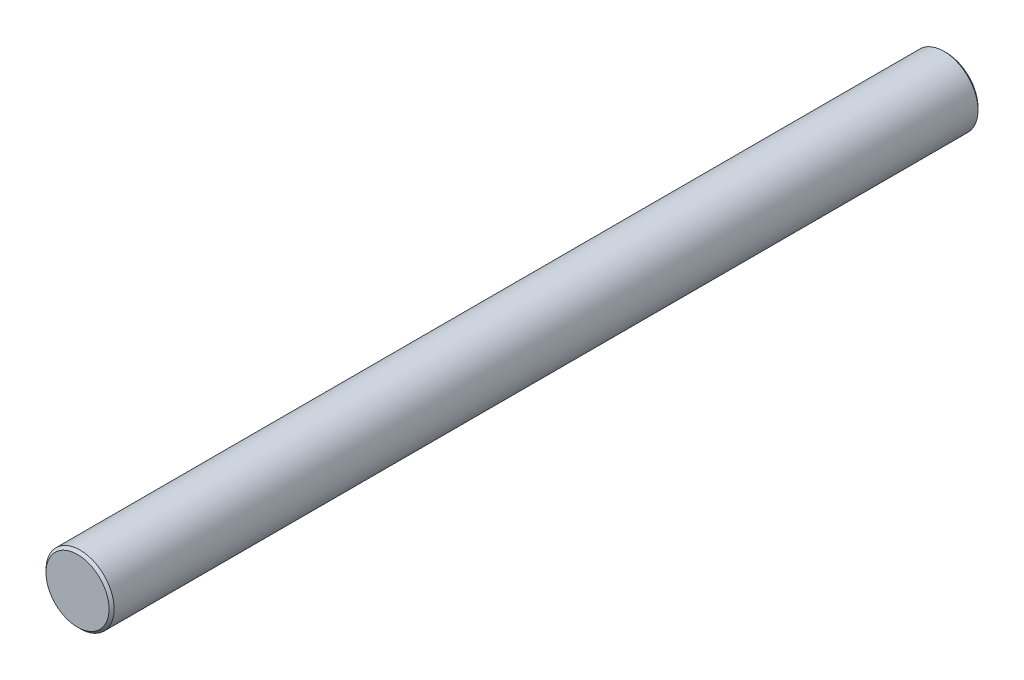
ISO-10303-21;
HEADER;
FILE_DESCRIPTION(('STEP AP214'),'2;1');
FILE_NAME('part.step','',(''),(''),'','','');
FILE_SCHEMA(('AUTOMOTIVE_DESIGN { 1 0 10303 214 1 1 1 1 }'));
ENDSEC;
DATA;
#1=APPLICATION_CONTEXT('core data for automotive mechanical design processes');
#2=APPLICATION_PROTOCOL_DEFINITION('international standard','automotive_design',2000,#1);
#3=PRODUCT_CONTEXT('',#1,'mechanical');
#4=PRODUCT('Part','Part','',(#3));
#5=PRODUCT_RELATED_PRODUCT_CATEGORY('part','',(#4));
#6=PRODUCT_DEFINITION_FORMATION('','',#4);
#7=PRODUCT_DEFINITION_CONTEXT('part definition',#1,'design');
#8=PRODUCT_DEFINITION('design','',#6,#7);
#9=PRODUCT_DEFINITION_SHAPE('','',#8);
#10=(LENGTH_UNIT() NAMED_UNIT(*) SI_UNIT(.MILLI.,.METRE.));
#11=(NAMED_UNIT(*) PLANE_ANGLE_UNIT() SI_UNIT($,.RADIAN.));
#12=(NAMED_UNIT(*) SI_UNIT($,.STERADIAN.) SOLID_ANGLE_UNIT());
#13=UNCERTAINTY_MEASURE_WITH_UNIT(LENGTH_MEASURE(1.E-05),#10,'distance_accuracy_value','');
#14=(GEOMETRIC_REPRESENTATION_CONTEXT(3) GLOBAL_UNCERTAINTY_ASSIGNED_CONTEXT((#13)) GLOBAL_UNIT_ASSIGNED_CONTEXT((#10,
#11,#12)) REPRESENTATION_CONTEXT('',''));
#15=CARTESIAN_POINT('',(0.,0.,0.));
#16=DIRECTION('',(0.,0.,1.));
#17=DIRECTION('',(1.,0.,0.));
#18=AXIS2_PLACEMENT_3D('',#15,#16,#17);
#19=CARTESIAN_POINT('',(0.,9.25,0.));
#20=DIRECTION('',(0.,0.,-1.));
#21=DIRECTION('',(0.,1.,0.));
#22=AXIS2_PLACEMENT_3D('',#19,#20,#21);
#23=PLANE('',#22);
#24=CARTESIAN_POINT('',(0.,0.,0.));
#25=DIRECTION('',(0.,0.,-1.));
#26=DIRECTION('',(0.,1.,0.));
#27=AXIS2_PLACEMENT_3D('',#24,#25,#26);
#28=CIRCLE('',#27,18.5);
#29=CARTESIAN_POINT('',(0.,18.5,0.));
#30=VERTEX_POINT('',#29);
#31=EDGE_CURVE('E9',#30,#30,#28,.T.);
#32=ORIENTED_EDGE('',*,*,#31,.T.);
#33=EDGE_LOOP('',(#32));
#34=FACE_BOUND('',#33,.T.);
#35=CARTESIAN_POINT('',(0.,0.,0.));
#36=DIRECTION('',(0.,0.,1.));
#37=DIRECTION('',(-1.,0.,0.));
#38=AXIS2_PLACEMENT_3D('',#35,#36,#37);
#39=CIRCLE('',#38,6.);
#40=CARTESIAN_POINT('',(-6.,0.,0.));
#41=VERTEX_POINT('',#40);
#42=EDGE_CURVE('E68',#41,#41,#39,.T.);
#43=ORIENTED_EDGE('',*,*,#42,.T.);
#44=EDGE_LOOP('',(#43));
#45=FACE_BOUND('',#44,.T.);
#46=ADVANCED_FACE('F15',(#34,#45),#23,.T.);
#47=CARTESIAN_POINT('',(0.,0.,0.75));
#48=DIRECTION('',(0.,0.,1.));
#49=DIRECTION('',(0.,1.,0.));
#50=AXIS2_PLACEMENT_3D('',#47,#48,#49);
#51=CONICAL_SURFACE('',#50,19.25,0.785398163397448);
#52=CARTESIAN_POINT('',(0.,0.,1.5));
#53=DIRECTION('',(0.,0.,-1.));
#54=DIRECTION('',(0.,1.,0.));
#55=AXIS2_PLACEMENT_3D('',#52,#53,#54);
#56=CIRCLE('',#55,20.);
#57=CARTESIAN_POINT('',(0.,20.,1.5));
#58=VERTEX_POINT('',#57);
#59=EDGE_CURVE('E22',#58,#58,#56,.T.);
#60=ORIENTED_EDGE('',*,*,#59,.T.);
#61=EDGE_LOOP('',(#60));
#62=FACE_BOUND('',#61,.T.);
#63=ORIENTED_EDGE('',*,*,#31,.F.);
#64=EDGE_LOOP('',(#63));
#65=FACE_BOUND('',#64,.T.);
#66=ADVANCED_FACE('F113',(#62,#65),#51,.T.);
#67=CARTESIAN_POINT('',(0.,0.,255.));
#68=DIRECTION('',(0.,0.,1.));
#69=DIRECTION('',(0.,1.,0.));
#70=AXIS2_PLACEMENT_3D('',#67,#68,#69);
#71=CYLINDRICAL_SURFACE('',#70,20.);
#72=CARTESIAN_POINT('',(0.,0.,508.5));
#73=DIRECTION('',(0.,0.,-1.));
#74=DIRECTION('',(0.,1.,0.));
#75=AXIS2_PLACEMENT_3D('',#72,#73,#74);
#76=CIRCLE('',#75,20.);
#77=CARTESIAN_POINT('',(0.,20.,508.5));
#78=VERTEX_POINT('',#77);
#79=EDGE_CURVE('E64',#78,#78,#76,.T.);
#80=ORIENTED_EDGE('',*,*,#79,.T.);
#81=EDGE_LOOP('',(#80));
#82=FACE_BOUND('',#81,.T.);
#83=ORIENTED_EDGE('',*,*,#59,.F.);
#84=EDGE_LOOP('',(#83));
#85=FACE_BOUND('',#84,.T.);
#86=CARTESIAN_POINT('',(0.,0.,6.5));
#87=DIRECTION('',(0.,0.,-1.));
#88=DIRECTION('',(0.,1.,0.));
#89=AXIS2_PLACEMENT_3D('',#86,#87,#88);
#90=CIRCLE('',#89,20.);
#91=CARTESIAN_POINT('',(10.5356537528527,-17.,6.5));
#92=VERTEX_POINT('',#91);
#93=CARTESIAN_POINT('',(-10.5356537528527,-17.,6.5));
#94=VERTEX_POINT('',#93);
#95=EDGE_CURVE('E82',#92,#94,#90,.T.);
#96=ORIENTED_EDGE('',*,*,#95,.T.);
#97=DIRECTION('',(0.,0.,1.));
#98=VECTOR('',#97,1.);
#99=CARTESIAN_POINT('',(-10.5356537528527,-17.,8.25));
#100=LINE('',#99,#98);
#101=CARTESIAN_POINT('',(-10.5356537528527,-17.,10.));
#102=VERTEX_POINT('',#101);
#103=EDGE_CURVE('E75',#94,#102,#100,.T.);
#104=ORIENTED_EDGE('',*,*,#103,.T.);
#105=CARTESIAN_POINT('',(0.,0.,10.));
#106=DIRECTION('',(0.,0.,1.));
#107=DIRECTION('',(0.,1.,0.));
#108=AXIS2_PLACEMENT_3D('',#105,#106,#107);
#109=CIRCLE('',#108,20.);
#110=CARTESIAN_POINT('',(10.5356537528527,-17.,10.));
#111=VERTEX_POINT('',#110);
#112=EDGE_CURVE('E88',#102,#111,#109,.T.);
#113=ORIENTED_EDGE('',*,*,#112,.T.);
#114=DIRECTION('',(0.,0.,-1.));
#115=VECTOR('',#114,1.);
#116=CARTESIAN_POINT('',(10.5356537528527,-17.,8.25));
#117=LINE('',#116,#115);
#118=EDGE_CURVE('E74',#111,#92,#117,.T.);
#119=ORIENTED_EDGE('',*,*,#118,.T.);
#120=EDGE_LOOP('',(#96,#104,#113,#119));
#121=FACE_BOUND('',#120,.T.);
#122=ADVANCED_FACE('F92',(#82,#85,#121),#71,.T.);
#123=CARTESIAN_POINT('',(0.,0.,509.25));
#124=DIRECTION('',(0.,0.,-1.));
#125=DIRECTION('',(0.,1.,0.));
#126=AXIS2_PLACEMENT_3D('',#123,#124,#125);
#127=CONICAL_SURFACE('',#126,19.25,0.785398163397448);
#128=CARTESIAN_POINT('',(0.,0.,510.));
#129=DIRECTION('',(0.,0.,-1.));
#130=DIRECTION('',(0.,1.,0.));
#131=AXIS2_PLACEMENT_3D('',#128,#129,#130);
#132=CIRCLE('',#131,18.5);
#133=CARTESIAN_POINT('',(0.,18.5,510.));
#134=VERTEX_POINT('',#133);
#135=EDGE_CURVE('E60',#134,#134,#132,.T.);
#136=ORIENTED_EDGE('',*,*,#135,.T.);
#137=EDGE_LOOP('',(#136));
#138=FACE_BOUND('',#137,.T.);
#139=ORIENTED_EDGE('',*,*,#79,.F.);
#140=EDGE_LOOP('',(#139));
#141=FACE_BOUND('',#140,.T.);
#142=ADVANCED_FACE('F61',(#138,#141),#127,.T.);
#143=CARTESIAN_POINT('',(0.,9.25,510.));
#144=DIRECTION('',(0.,0.,1.));
#145=DIRECTION('',(0.,-1.,0.));
#146=AXIS2_PLACEMENT_3D('',#143,#144,#145);
#147=PLANE('',#146);
#148=ORIENTED_EDGE('',*,*,#135,.F.);
#149=EDGE_LOOP('',(#148));
#150=FACE_BOUND('',#149,.T.);
#151=ADVANCED_FACE('F135',(#150),#147,.T.);
#152=CARTESIAN_POINT('',(0.,0.,26.4586213285198));
#153=DIRECTION('',(0.,0.,-1.));
#154=DIRECTION('',(-1.,0.,0.));
#155=AXIS2_PLACEMENT_3D('',#152,#153,#154);
#156=CONICAL_SURFACE('',#155,2.52640625,1.0471975511966);
#157=CARTESIAN_POINT('',(0.,0.,25.));
#158=DIRECTION('',(0.,0.,1.));
#159=DIRECTION('',(-1.,0.,0.));
#160=AXIS2_PLACEMENT_3D('',#157,#158,#159);
#161=CIRCLE('',#160,5.0528125);
#162=CARTESIAN_POINT('',(-5.0528125,0.,25.));
#163=VERTEX_POINT('',#162);
#164=EDGE_CURVE('E65',#163,#163,#161,.T.);
#165=ORIENTED_EDGE('',*,*,#164,.F.);
#166=EDGE_LOOP('',(#165));
#167=FACE_BOUND('',#166,.T.);
#168=CARTESIAN_POINT('',(0.,0.,27.9172426570397));
#169=VERTEX_POINT('',#168);
#170=VERTEX_LOOP('',#169);
#171=FACE_BOUND('',#170,.T.);
#172=ADVANCED_FACE('F129',(#167,#171),#156,.F.);
#173=CARTESIAN_POINT('',(0.,0.,12.97359375));
#174=DIRECTION('',(0.,0.,-1.));
#175=DIRECTION('',(-1.,0.,0.));
#176=AXIS2_PLACEMENT_3D('',#173,#174,#175);
#177=CYLINDRICAL_SURFACE('',#176,5.0528125);
#178=CARTESIAN_POINT('',(0.,0.,0.9471875));
#179=DIRECTION('',(0.,0.,1.));
#180=DIRECTION('',(-1.,0.,0.));
#181=AXIS2_PLACEMENT_3D('',#178,#179,#180);
#182=CIRCLE('',#181,5.0528125);
#183=CARTESIAN_POINT('',(-5.0528125,0.,0.9471875));
#184=VERTEX_POINT('',#183);
#185=EDGE_CURVE('E71',#184,#184,#182,.T.);
#186=ORIENTED_EDGE('',*,*,#185,.F.);
#187=EDGE_LOOP('',(#186));
#188=FACE_BOUND('',#187,.T.);
#189=ORIENTED_EDGE('',*,*,#164,.T.);
#190=EDGE_LOOP('',(#189));
#191=FACE_BOUND('',#190,.T.);
#192=ADVANCED_FACE('F123',(#188,#191),#177,.F.);
#193=CARTESIAN_POINT('',(0.,0.,0.47359375));
#194=DIRECTION('',(0.,0.,-1.));
#195=DIRECTION('',(-1.,0.,0.));
#196=AXIS2_PLACEMENT_3D('',#193,#194,#195);
#197=CONICAL_SURFACE('',#196,5.52640625,0.785398163397448);
#198=ORIENTED_EDGE('',*,*,#42,.F.);
#199=EDGE_LOOP('',(#198));
#200=FACE_BOUND('',#199,.T.);
#201=ORIENTED_EDGE('',*,*,#185,.T.);
#202=EDGE_LOOP('',(#201));
#203=FACE_BOUND('',#202,.T.);
#204=ADVANCED_FACE('F110',(#200,#203),#197,.F.);
#205=CARTESIAN_POINT('',(0.,-17.,8.25));
#206=DIRECTION('',(0.,-1.,0.));
#207=DIRECTION('',(0.,0.,-1.));
#208=AXIS2_PLACEMENT_3D('',#205,#206,#207);
#209=PLANE('',#208);
#210=ORIENTED_EDGE('',*,*,#103,.F.);
#211=DIRECTION('',(1.,0.,0.));
#212=VECTOR('',#211,1.);
#213=CARTESIAN_POINT('',(0.,-17.,6.5));
#214=LINE('',#213,#212);
#215=EDGE_CURVE('E79',#94,#92,#214,.T.);
#216=ORIENTED_EDGE('',*,*,#215,.T.);
#217=ORIENTED_EDGE('',*,*,#118,.F.);
#218=DIRECTION('',(-1.,0.,0.));
#219=VECTOR('',#218,1.);
#220=CARTESIAN_POINT('',(0.,-17.,10.));
#221=LINE('',#220,#219);
#222=EDGE_CURVE('E85',#111,#102,#221,.T.);
#223=ORIENTED_EDGE('',*,*,#222,.T.);
#224=EDGE_LOOP('',(#210,#216,#217,#223));
#225=FACE_BOUND('',#224,.T.);
#226=ADVANCED_FACE('F97',(#225),#209,.T.);
#227=CARTESIAN_POINT('',(0.,-19.5,6.5));
#228=DIRECTION('',(0.,0.,1.));
#229=DIRECTION('',(1.,0.,0.));
#230=AXIS2_PLACEMENT_3D('',#227,#228,#229);
#231=PLANE('',#230);
#232=ORIENTED_EDGE('',*,*,#95,.F.);
#233=ORIENTED_EDGE('',*,*,#215,.F.);
#234=EDGE_LOOP('',(#232,#233));
#235=FACE_BOUND('',#234,.T.);
#236=ADVANCED_FACE('F101',(#235),#231,.T.);
#237=CARTESIAN_POINT('',(0.,-19.5,10.));
#238=DIRECTION('',(0.,0.,1.));
#239=DIRECTION('',(1.,0.,0.));
#240=AXIS2_PLACEMENT_3D('',#237,#238,#239);
#241=PLANE('',#240);
#242=ORIENTED_EDGE('',*,*,#112,.F.);
#243=ORIENTED_EDGE('',*,*,#222,.F.);
#244=EDGE_LOOP('',(#242,#243));
#245=FACE_BOUND('',#244,.T.);
#246=ADVANCED_FACE('F95',(#245),#241,.F.);
#247=CLOSED_SHELL('',(#46,#66,#122,#142,#151,#172,#192,#204,#226,#236,#246));
#248=MANIFOLD_SOLID_BREP('B1',#247);
#249=ADVANCED_BREP_SHAPE_REPRESENTATION('',(#18,#248),#14);
#250=SHAPE_DEFINITION_REPRESENTATION(#9,#249);
ENDSEC;
END-ISO-10303-21;
